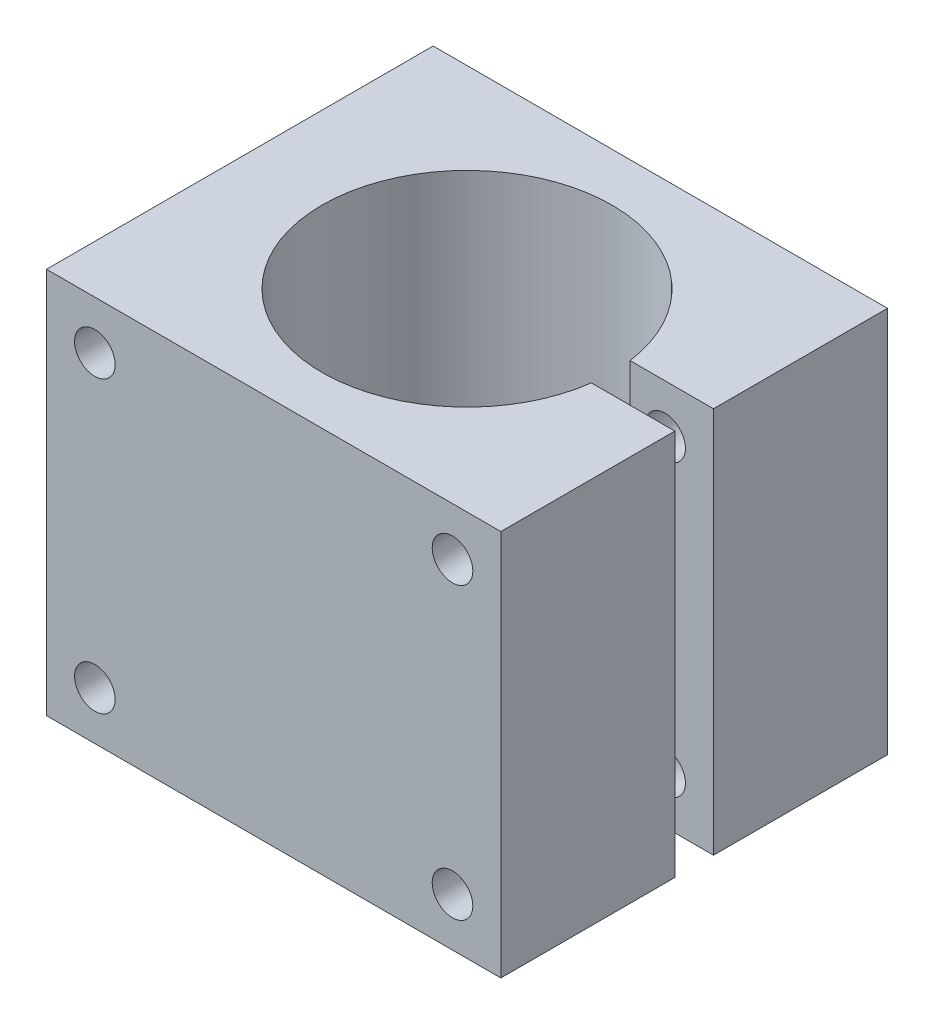
ISO-10303-21;
HEADER;
FILE_DESCRIPTION(('STEP AP214'),'2;1');
FILE_NAME('part.step','',(''),(''),'','','');
FILE_SCHEMA(('AUTOMOTIVE_DESIGN { 1 0 10303 214 1 1 1 1 }'));
ENDSEC;
DATA;
#1=APPLICATION_CONTEXT('core data for automotive mechanical design processes');
#2=APPLICATION_PROTOCOL_DEFINITION('international standard','automotive_design',2000,#1);
#3=PRODUCT_CONTEXT('',#1,'mechanical');
#4=PRODUCT('Part','Part','',(#3));
#5=PRODUCT_RELATED_PRODUCT_CATEGORY('part','',(#4));
#6=PRODUCT_DEFINITION_FORMATION('','',#4);
#7=PRODUCT_DEFINITION_CONTEXT('part definition',#1,'design');
#8=PRODUCT_DEFINITION('design','',#6,#7);
#9=PRODUCT_DEFINITION_SHAPE('','',#8);
#10=(LENGTH_UNIT() NAMED_UNIT(*) SI_UNIT(.MILLI.,.METRE.));
#11=(NAMED_UNIT(*) PLANE_ANGLE_UNIT() SI_UNIT($,.RADIAN.));
#12=(NAMED_UNIT(*) SI_UNIT($,.STERADIAN.) SOLID_ANGLE_UNIT());
#13=UNCERTAINTY_MEASURE_WITH_UNIT(LENGTH_MEASURE(1.E-05),#10,'distance_accuracy_value','');
#14=(GEOMETRIC_REPRESENTATION_CONTEXT(3) GLOBAL_UNCERTAINTY_ASSIGNED_CONTEXT((#13)) GLOBAL_UNIT_ASSIGNED_CONTEXT((#10,
#11,#12)) REPRESENTATION_CONTEXT('',''));
#15=CARTESIAN_POINT('',(0.,0.,0.));
#16=DIRECTION('',(0.,0.,1.));
#17=DIRECTION('',(1.,0.,0.));
#18=AXIS2_PLACEMENT_3D('',#15,#16,#17);
#19=CARTESIAN_POINT('',(42.,-5.,40.));
#20=DIRECTION('',(-1.,0.,0.));
#21=DIRECTION('',(0.,0.,1.));
#22=AXIS2_PLACEMENT_3D('',#19,#20,#21);
#23=PLANE('',#22);
#24=DIRECTION('',(0.,1.,0.));
#25=VECTOR('',#24,1.);
#26=CARTESIAN_POINT('',(42.,-5.,22.));
#27=LINE('',#26,#25);
#28=CARTESIAN_POINT('',(42.,-5.,22.));
#29=VERTEX_POINT('',#28);
#30=CARTESIAN_POINT('',(42.,35.,22.));
#31=VERTEX_POINT('',#30);
#32=EDGE_CURVE('E97',#29,#31,#27,.T.);
#33=ORIENTED_EDGE('',*,*,#32,.T.);
#34=DIRECTION('',(0.,0.,-1.));
#35=VECTOR('',#34,1.);
#36=CARTESIAN_POINT('',(42.,35.,40.));
#37=LINE('',#36,#35);
#38=CARTESIAN_POINT('',(42.,35.,40.));
#39=VERTEX_POINT('',#38);
#40=EDGE_CURVE('E121',#39,#31,#37,.T.);
#41=ORIENTED_EDGE('',*,*,#40,.F.);
#42=DIRECTION('',(0.,1.,0.));
#43=VECTOR('',#42,1.);
#44=CARTESIAN_POINT('',(42.,-5.,40.));
#45=LINE('',#44,#43);
#46=CARTESIAN_POINT('',(42.,-5.,40.));
#47=VERTEX_POINT('',#46);
#48=EDGE_CURVE('E119',#47,#39,#45,.T.);
#49=ORIENTED_EDGE('',*,*,#48,.F.);
#50=DIRECTION('',(0.,0.,-1.));
#51=VECTOR('',#50,1.);
#52=CARTESIAN_POINT('',(42.,-5.,40.));
#53=LINE('',#52,#51);
#54=EDGE_CURVE('E42',#47,#29,#53,.T.);
#55=ORIENTED_EDGE('',*,*,#54,.T.);
#56=EDGE_LOOP('',(#33,#41,#49,#55));
#57=FACE_BOUND('',#56,.T.);
#58=ADVANCED_FACE('F34',(#57),#23,.F.);
#59=CARTESIAN_POINT('',(37.,0.,40.));
#60=DIRECTION('',(0.,0.,-1.));
#61=DIRECTION('',(-1.,0.,0.));
#62=AXIS2_PLACEMENT_3D('',#59,#60,#61);
#63=CYLINDRICAL_SURFACE('',#62,2.1);
#64=CARTESIAN_POINT('',(37.,0.,40.));
#65=DIRECTION('',(0.,0.,1.));
#66=DIRECTION('',(1.,0.,0.));
#67=AXIS2_PLACEMENT_3D('',#64,#65,#66);
#68=CIRCLE('',#67,2.1);
#69=CARTESIAN_POINT('',(39.1,0.,40.));
#70=VERTEX_POINT('',#69);
#71=EDGE_CURVE('E151',#70,#70,#68,.T.);
#72=ORIENTED_EDGE('',*,*,#71,.T.);
#73=EDGE_LOOP('',(#72));
#74=FACE_BOUND('',#73,.T.);
#75=CARTESIAN_POINT('',(37.,0.,22.));
#76=DIRECTION('',(0.,0.,-1.));
#77=DIRECTION('',(-1.,0.,0.));
#78=AXIS2_PLACEMENT_3D('',#75,#76,#77);
#79=CIRCLE('',#78,2.1);
#80=CARTESIAN_POINT('',(34.9,0.,22.));
#81=VERTEX_POINT('',#80);
#82=EDGE_CURVE('E181',#81,#81,#79,.T.);
#83=ORIENTED_EDGE('',*,*,#82,.T.);
#84=EDGE_LOOP('',(#83));
#85=FACE_BOUND('',#84,.T.);
#86=ADVANCED_FACE('F227',(#74,#85),#63,.F.);
#87=CARTESIAN_POINT('',(37.,30.,40.));
#88=DIRECTION('',(0.,0.,-1.));
#89=DIRECTION('',(-1.,0.,0.));
#90=AXIS2_PLACEMENT_3D('',#87,#88,#89);
#91=CYLINDRICAL_SURFACE('',#90,2.1);
#92=CARTESIAN_POINT('',(37.,30.,40.));
#93=DIRECTION('',(0.,0.,1.));
#94=DIRECTION('',(1.,0.,0.));
#95=AXIS2_PLACEMENT_3D('',#92,#93,#94);
#96=CIRCLE('',#95,2.1);
#97=CARTESIAN_POINT('',(39.1,30.,40.));
#98=VERTEX_POINT('',#97);
#99=EDGE_CURVE('E163',#98,#98,#96,.T.);
#100=ORIENTED_EDGE('',*,*,#99,.T.);
#101=EDGE_LOOP('',(#100));
#102=FACE_BOUND('',#101,.T.);
#103=CARTESIAN_POINT('',(37.,30.,22.));
#104=DIRECTION('',(0.,0.,-1.));
#105=DIRECTION('',(-1.,0.,0.));
#106=AXIS2_PLACEMENT_3D('',#103,#104,#105);
#107=CIRCLE('',#106,2.1);
#108=CARTESIAN_POINT('',(34.9,30.,22.));
#109=VERTEX_POINT('',#108);
#110=EDGE_CURVE('E184',#109,#109,#107,.T.);
#111=ORIENTED_EDGE('',*,*,#110,.T.);
#112=EDGE_LOOP('',(#111));
#113=FACE_BOUND('',#112,.T.);
#114=ADVANCED_FACE('F232',(#102,#113),#91,.F.);
#115=CARTESIAN_POINT('',(0.,0.,40.));
#116=DIRECTION('',(0.,0.,-1.));
#117=DIRECTION('',(-1.,0.,0.));
#118=AXIS2_PLACEMENT_3D('',#115,#116,#117);
#119=PLANE('',#118);
#120=CARTESIAN_POINT('',(0.,30.,40.));
#121=DIRECTION('',(0.,0.,1.));
#122=DIRECTION('',(1.,0.,0.));
#123=AXIS2_PLACEMENT_3D('',#120,#121,#122);
#124=CIRCLE('',#123,2.1);
#125=CARTESIAN_POINT('',(2.1,30.,40.));
#126=VERTEX_POINT('',#125);
#127=EDGE_CURVE('E157',#126,#126,#124,.T.);
#128=ORIENTED_EDGE('',*,*,#127,.F.);
#129=EDGE_LOOP('',(#128));
#130=FACE_BOUND('',#129,.T.);
#131=CARTESIAN_POINT('',(0.,0.,40.));
#132=DIRECTION('',(0.,0.,1.));
#133=DIRECTION('',(1.,0.,0.));
#134=AXIS2_PLACEMENT_3D('',#131,#132,#133);
#135=CIRCLE('',#134,2.1);
#136=CARTESIAN_POINT('',(2.1,0.,40.));
#137=VERTEX_POINT('',#136);
#138=EDGE_CURVE('E141',#137,#137,#135,.T.);
#139=ORIENTED_EDGE('',*,*,#138,.F.);
#140=EDGE_LOOP('',(#139));
#141=FACE_BOUND('',#140,.T.);
#142=DIRECTION('',(0.,-1.,0.));
#143=VECTOR('',#142,1.);
#144=CARTESIAN_POINT('',(-5.,-5.,40.));
#145=LINE('',#144,#143);
#146=CARTESIAN_POINT('',(-5.,35.,40.));
#147=VERTEX_POINT('',#146);
#148=CARTESIAN_POINT('',(-5.,-5.,40.));
#149=VERTEX_POINT('',#148);
#150=EDGE_CURVE('E131',#147,#149,#145,.T.);
#151=ORIENTED_EDGE('',*,*,#150,.T.);
#152=DIRECTION('',(1.,0.,0.));
#153=VECTOR('',#152,1.);
#154=CARTESIAN_POINT('',(-5.,-5.,40.));
#155=LINE('',#154,#153);
#156=EDGE_CURVE('E144',#149,#47,#155,.T.);
#157=ORIENTED_EDGE('',*,*,#156,.T.);
#158=ORIENTED_EDGE('',*,*,#48,.T.);
#159=DIRECTION('',(-1.,0.,0.));
#160=VECTOR('',#159,1.);
#161=CARTESIAN_POINT('',(-5.,35.,40.));
#162=LINE('',#161,#160);
#163=EDGE_CURVE('E128',#39,#147,#162,.T.);
#164=ORIENTED_EDGE('',*,*,#163,.T.);
#165=EDGE_LOOP('',(#151,#157,#158,#164));
#166=FACE_BOUND('',#165,.T.);
#167=ORIENTED_EDGE('',*,*,#71,.F.);
#168=EDGE_LOOP('',(#167));
#169=FACE_BOUND('',#168,.T.);
#170=ORIENTED_EDGE('',*,*,#99,.F.);
#171=EDGE_LOOP('',(#170));
#172=FACE_BOUND('',#171,.T.);
#173=ADVANCED_FACE('F203',(#130,#141,#166,#169,#172),#119,.F.);
#174=CARTESIAN_POINT('',(0.,0.,0.));
#175=DIRECTION('',(0.,0.,-1.));
#176=DIRECTION('',(-1.,0.,0.));
#177=AXIS2_PLACEMENT_3D('',#174,#175,#176);
#178=PLANE('',#177);
#179=CARTESIAN_POINT('',(0.,30.,0.));
#180=DIRECTION('',(0.,0.,1.));
#181=DIRECTION('',(1.,0.,0.));
#182=AXIS2_PLACEMENT_3D('',#179,#180,#181);
#183=CIRCLE('',#182,2.1);
#184=CARTESIAN_POINT('',(2.1,30.,0.));
#185=VERTEX_POINT('',#184);
#186=EDGE_CURVE('E160',#185,#185,#183,.T.);
#187=ORIENTED_EDGE('',*,*,#186,.T.);
#188=EDGE_LOOP('',(#187));
#189=FACE_BOUND('',#188,.T.);
#190=CARTESIAN_POINT('',(0.,0.,0.));
#191=DIRECTION('',(0.,0.,1.));
#192=DIRECTION('',(1.,0.,0.));
#193=AXIS2_PLACEMENT_3D('',#190,#191,#192);
#194=CIRCLE('',#193,2.1);
#195=CARTESIAN_POINT('',(2.1,0.,0.));
#196=VERTEX_POINT('',#195);
#197=EDGE_CURVE('E148',#196,#196,#194,.T.);
#198=ORIENTED_EDGE('',*,*,#197,.T.);
#199=EDGE_LOOP('',(#198));
#200=FACE_BOUND('',#199,.T.);
#201=DIRECTION('',(0.,-1.,0.));
#202=VECTOR('',#201,1.);
#203=CARTESIAN_POINT('',(-5.,-5.,0.));
#204=LINE('',#203,#202);
#205=CARTESIAN_POINT('',(-5.,35.,0.));
#206=VERTEX_POINT('',#205);
#207=CARTESIAN_POINT('',(-5.,-5.,0.));
#208=VERTEX_POINT('',#207);
#209=EDGE_CURVE('E138',#206,#208,#204,.T.);
#210=ORIENTED_EDGE('',*,*,#209,.F.);
#211=DIRECTION('',(-1.,0.,0.));
#212=VECTOR('',#211,1.);
#213=CARTESIAN_POINT('',(-5.,35.,0.));
#214=LINE('',#213,#212);
#215=CARTESIAN_POINT('',(42.,35.,0.));
#216=VERTEX_POINT('',#215);
#217=EDGE_CURVE('E129',#216,#206,#214,.T.);
#218=ORIENTED_EDGE('',*,*,#217,.F.);
#219=DIRECTION('',(0.,1.,0.));
#220=VECTOR('',#219,1.);
#221=CARTESIAN_POINT('',(42.,-5.,0.));
#222=LINE('',#221,#220);
#223=CARTESIAN_POINT('',(42.,-5.,0.));
#224=VERTEX_POINT('',#223);
#225=EDGE_CURVE('E132',#224,#216,#222,.T.);
#226=ORIENTED_EDGE('',*,*,#225,.F.);
#227=DIRECTION('',(1.,0.,0.));
#228=VECTOR('',#227,1.);
#229=CARTESIAN_POINT('',(-5.,-5.,0.));
#230=LINE('',#229,#228);
#231=EDGE_CURVE('E135',#208,#224,#230,.T.);
#232=ORIENTED_EDGE('',*,*,#231,.F.);
#233=EDGE_LOOP('',(#210,#218,#226,#232));
#234=FACE_BOUND('',#233,.T.);
#235=CARTESIAN_POINT('',(37.,0.,0.));
#236=DIRECTION('',(0.,0.,1.));
#237=DIRECTION('',(1.,0.,0.));
#238=AXIS2_PLACEMENT_3D('',#235,#236,#237);
#239=CIRCLE('',#238,2.1);
#240=CARTESIAN_POINT('',(39.1,0.,0.));
#241=VERTEX_POINT('',#240);
#242=EDGE_CURVE('E154',#241,#241,#239,.T.);
#243=ORIENTED_EDGE('',*,*,#242,.T.);
#244=EDGE_LOOP('',(#243));
#245=FACE_BOUND('',#244,.T.);
#246=CARTESIAN_POINT('',(37.,30.,0.));
#247=DIRECTION('',(0.,0.,1.));
#248=DIRECTION('',(1.,0.,0.));
#249=AXIS2_PLACEMENT_3D('',#246,#247,#248);
#250=CIRCLE('',#249,2.1);
#251=CARTESIAN_POINT('',(39.1,30.,0.));
#252=VERTEX_POINT('',#251);
#253=EDGE_CURVE('E166',#252,#252,#250,.T.);
#254=ORIENTED_EDGE('',*,*,#253,.T.);
#255=EDGE_LOOP('',(#254));
#256=FACE_BOUND('',#255,.T.);
#257=ADVANCED_FACE('F211',(#189,#200,#234,#245,#256),#178,.T.);
#258=CARTESIAN_POINT('',(-5.,-5.,40.));
#259=DIRECTION('',(1.,0.,0.));
#260=DIRECTION('',(0.,0.,-1.));
#261=AXIS2_PLACEMENT_3D('',#258,#259,#260);
#262=PLANE('',#261);
#263=ORIENTED_EDGE('',*,*,#209,.T.);
#264=DIRECTION('',(0.,0.,-1.));
#265=VECTOR('',#264,1.);
#266=CARTESIAN_POINT('',(-5.,-5.,40.));
#267=LINE('',#266,#265);
#268=EDGE_CURVE('E12',#149,#208,#267,.T.);
#269=ORIENTED_EDGE('',*,*,#268,.F.);
#270=ORIENTED_EDGE('',*,*,#150,.F.);
#271=DIRECTION('',(0.,0.,-1.));
#272=VECTOR('',#271,1.);
#273=CARTESIAN_POINT('',(-5.,35.,40.));
#274=LINE('',#273,#272);
#275=EDGE_CURVE('E125',#147,#206,#274,.T.);
#276=ORIENTED_EDGE('',*,*,#275,.T.);
#277=EDGE_LOOP('',(#263,#269,#270,#276));
#278=FACE_BOUND('',#277,.T.);
#279=ADVANCED_FACE('F36',(#278),#262,.F.);
#280=CARTESIAN_POINT('',(-5.,-5.,40.));
#281=DIRECTION('',(0.,1.,0.));
#282=DIRECTION('',(-1.,0.,0.));
#283=AXIS2_PLACEMENT_3D('',#280,#281,#282);
#284=PLANE('',#283);
#285=CARTESIAN_POINT('',(42.,-5.,18.));
#286=VERTEX_POINT('',#285);
#287=EDGE_CURVE('E120',#286,#224,#53,.T.);
#288=ORIENTED_EDGE('',*,*,#287,.F.);
#289=DIRECTION('',(-1.,0.,0.));
#290=VECTOR('',#289,1.);
#291=CARTESIAN_POINT('',(0.,-5.,18.));
#292=LINE('',#291,#290);
#293=CARTESIAN_POINT('',(33.3660687473185,-5.,18.));
#294=VERTEX_POINT('',#293);
#295=EDGE_CURVE('E117',#286,#294,#292,.T.);
#296=ORIENTED_EDGE('',*,*,#295,.T.);
#297=CARTESIAN_POINT('',(18.5,-5.,20.));
#298=DIRECTION('',(0.,1.,0.));
#299=DIRECTION('',(0.,0.,1.));
#300=AXIS2_PLACEMENT_3D('',#297,#298,#299);
#301=CIRCLE('',#300,15.);
#302=CARTESIAN_POINT('',(33.3660687473185,-5.,22.));
#303=VERTEX_POINT('',#302);
#304=EDGE_CURVE('E116',#294,#303,#301,.T.);
#305=ORIENTED_EDGE('',*,*,#304,.T.);
#306=DIRECTION('',(-1.,0.,0.));
#307=VECTOR('',#306,1.);
#308=CARTESIAN_POINT('',(0.,-5.,22.));
#309=LINE('',#308,#307);
#310=EDGE_CURVE('E57',#29,#303,#309,.T.);
#311=ORIENTED_EDGE('',*,*,#310,.F.);
#312=ORIENTED_EDGE('',*,*,#54,.F.);
#313=ORIENTED_EDGE('',*,*,#156,.F.);
#314=ORIENTED_EDGE('',*,*,#268,.T.);
#315=ORIENTED_EDGE('',*,*,#231,.T.);
#316=EDGE_LOOP('',(#288,#296,#305,#311,#312,#313,#314,#315));
#317=FACE_BOUND('',#316,.T.);
#318=ADVANCED_FACE('F112',(#317),#284,.F.);
#319=CARTESIAN_POINT('',(42.,35.,18.));
#320=VERTEX_POINT('',#319);
#321=EDGE_CURVE('E124',#320,#216,#37,.T.);
#322=ORIENTED_EDGE('',*,*,#321,.F.);
#323=DIRECTION('',(0.,1.,0.));
#324=VECTOR('',#323,1.);
#325=CARTESIAN_POINT('',(42.,-5.,18.));
#326=LINE('',#325,#324);
#327=EDGE_CURVE('E105',#286,#320,#326,.T.);
#328=ORIENTED_EDGE('',*,*,#327,.F.);
#329=ORIENTED_EDGE('',*,*,#287,.T.);
#330=ORIENTED_EDGE('',*,*,#225,.T.);
#331=EDGE_LOOP('',(#322,#328,#329,#330));
#332=FACE_BOUND('',#331,.T.);
#333=ADVANCED_FACE('F215',(#332),#23,.F.);
#334=CARTESIAN_POINT('',(-5.,35.,40.));
#335=DIRECTION('',(0.,-1.,0.));
#336=DIRECTION('',(0.,0.,-1.));
#337=AXIS2_PLACEMENT_3D('',#334,#335,#336);
#338=PLANE('',#337);
#339=CARTESIAN_POINT('',(18.5,35.,20.));
#340=DIRECTION('',(0.,1.,0.));
#341=DIRECTION('',(0.,0.,1.));
#342=AXIS2_PLACEMENT_3D('',#339,#340,#341);
#343=CIRCLE('',#342,15.);
#344=CARTESIAN_POINT('',(33.3660687473185,35.,18.));
#345=VERTEX_POINT('',#344);
#346=CARTESIAN_POINT('',(33.3660687473185,35.,22.));
#347=VERTEX_POINT('',#346);
#348=EDGE_CURVE('E171',#345,#347,#343,.T.);
#349=ORIENTED_EDGE('',*,*,#348,.F.);
#350=DIRECTION('',(-1.,0.,0.));
#351=VECTOR('',#350,1.);
#352=CARTESIAN_POINT('',(0.,35.,18.));
#353=LINE('',#352,#351);
#354=EDGE_CURVE('E49',#320,#345,#353,.T.);
#355=ORIENTED_EDGE('',*,*,#354,.F.);
#356=ORIENTED_EDGE('',*,*,#321,.T.);
#357=ORIENTED_EDGE('',*,*,#217,.T.);
#358=ORIENTED_EDGE('',*,*,#275,.F.);
#359=ORIENTED_EDGE('',*,*,#163,.F.);
#360=ORIENTED_EDGE('',*,*,#40,.T.);
#361=DIRECTION('',(-1.,0.,0.));
#362=VECTOR('',#361,1.);
#363=CARTESIAN_POINT('',(0.,35.,22.));
#364=LINE('',#363,#362);
#365=EDGE_CURVE('E100',#31,#347,#364,.T.);
#366=ORIENTED_EDGE('',*,*,#365,.T.);
#367=EDGE_LOOP('',(#349,#355,#356,#357,#358,#359,#360,#366));
#368=FACE_BOUND('',#367,.T.);
#369=ADVANCED_FACE('F198',(#368),#338,.F.);
#370=CARTESIAN_POINT('',(0.,0.,40.));
#371=DIRECTION('',(0.,0.,-1.));
#372=DIRECTION('',(-1.,0.,0.));
#373=AXIS2_PLACEMENT_3D('',#370,#371,#372);
#374=CYLINDRICAL_SURFACE('',#373,2.1);
#375=ORIENTED_EDGE('',*,*,#138,.T.);
#376=EDGE_LOOP('',(#375));
#377=FACE_BOUND('',#376,.T.);
#378=ORIENTED_EDGE('',*,*,#197,.F.);
#379=EDGE_LOOP('',(#378));
#380=FACE_BOUND('',#379,.T.);
#381=ADVANCED_FACE('F242',(#377,#380),#374,.F.);
#382=CARTESIAN_POINT('',(37.,0.,18.));
#383=DIRECTION('',(0.,0.,-1.));
#384=DIRECTION('',(-1.,0.,0.));
#385=AXIS2_PLACEMENT_3D('',#382,#383,#384);
#386=CIRCLE('',#385,2.1);
#387=CARTESIAN_POINT('',(34.9,0.,18.));
#388=VERTEX_POINT('',#387);
#389=EDGE_CURVE('E174',#388,#388,#386,.T.);
#390=ORIENTED_EDGE('',*,*,#389,.F.);
#391=EDGE_LOOP('',(#390));
#392=FACE_BOUND('',#391,.T.);
#393=ORIENTED_EDGE('',*,*,#242,.F.);
#394=EDGE_LOOP('',(#393));
#395=FACE_BOUND('',#394,.T.);
#396=ADVANCED_FACE('F235',(#392,#395),#63,.F.);
#397=CARTESIAN_POINT('',(0.,30.,40.));
#398=DIRECTION('',(0.,0.,-1.));
#399=DIRECTION('',(-1.,0.,0.));
#400=AXIS2_PLACEMENT_3D('',#397,#398,#399);
#401=CYLINDRICAL_SURFACE('',#400,2.1);
#402=ORIENTED_EDGE('',*,*,#127,.T.);
#403=EDGE_LOOP('',(#402));
#404=FACE_BOUND('',#403,.T.);
#405=ORIENTED_EDGE('',*,*,#186,.F.);
#406=EDGE_LOOP('',(#405));
#407=FACE_BOUND('',#406,.T.);
#408=ADVANCED_FACE('F262',(#404,#407),#401,.F.);
#409=CARTESIAN_POINT('',(37.,30.,18.));
#410=DIRECTION('',(0.,0.,-1.));
#411=DIRECTION('',(-1.,0.,0.));
#412=AXIS2_PLACEMENT_3D('',#409,#410,#411);
#413=CIRCLE('',#412,2.1);
#414=CARTESIAN_POINT('',(34.9,30.,18.));
#415=VERTEX_POINT('',#414);
#416=EDGE_CURVE('E178',#415,#415,#413,.T.);
#417=ORIENTED_EDGE('',*,*,#416,.F.);
#418=EDGE_LOOP('',(#417));
#419=FACE_BOUND('',#418,.T.);
#420=ORIENTED_EDGE('',*,*,#253,.F.);
#421=EDGE_LOOP('',(#420));
#422=FACE_BOUND('',#421,.T.);
#423=ADVANCED_FACE('F266',(#419,#422),#91,.F.);
#424=CARTESIAN_POINT('',(18.5,-5.,20.));
#425=DIRECTION('',(0.,1.,0.));
#426=DIRECTION('',(0.,0.,1.));
#427=AXIS2_PLACEMENT_3D('',#424,#425,#426);
#428=CYLINDRICAL_SURFACE('',#427,15.);
#429=ORIENTED_EDGE('',*,*,#304,.F.);
#430=DIRECTION('',(0.,1.,0.));
#431=VECTOR('',#430,1.);
#432=CARTESIAN_POINT('',(33.3660687473185,-5.,18.));
#433=LINE('',#432,#431);
#434=EDGE_CURVE('E187',#294,#345,#433,.T.);
#435=ORIENTED_EDGE('',*,*,#434,.T.);
#436=ORIENTED_EDGE('',*,*,#348,.T.);
#437=DIRECTION('',(0.,1.,0.));
#438=VECTOR('',#437,1.);
#439=CARTESIAN_POINT('',(33.3660687473185,-5.,22.));
#440=LINE('',#439,#438);
#441=EDGE_CURVE('E106',#303,#347,#440,.T.);
#442=ORIENTED_EDGE('',*,*,#441,.F.);
#443=EDGE_LOOP('',(#429,#435,#436,#442));
#444=FACE_BOUND('',#443,.T.);
#445=ADVANCED_FACE('F195',(#444),#428,.F.);
#446=CARTESIAN_POINT('',(0.,-5.,22.));
#447=DIRECTION('',(0.,0.,-1.));
#448=DIRECTION('',(-1.,0.,0.));
#449=AXIS2_PLACEMENT_3D('',#446,#447,#448);
#450=PLANE('',#449);
#451=ORIENTED_EDGE('',*,*,#82,.F.);
#452=EDGE_LOOP('',(#451));
#453=FACE_BOUND('',#452,.T.);
#454=ORIENTED_EDGE('',*,*,#110,.F.);
#455=EDGE_LOOP('',(#454));
#456=FACE_BOUND('',#455,.T.);
#457=ORIENTED_EDGE('',*,*,#365,.F.);
#458=ORIENTED_EDGE('',*,*,#32,.F.);
#459=ORIENTED_EDGE('',*,*,#310,.T.);
#460=ORIENTED_EDGE('',*,*,#441,.T.);
#461=EDGE_LOOP('',(#457,#458,#459,#460));
#462=FACE_BOUND('',#461,.T.);
#463=ADVANCED_FACE('F98',(#453,#456,#462),#450,.T.);
#464=CARTESIAN_POINT('',(0.,-5.,18.));
#465=DIRECTION('',(0.,0.,-1.));
#466=DIRECTION('',(-1.,0.,0.));
#467=AXIS2_PLACEMENT_3D('',#464,#465,#466);
#468=PLANE('',#467);
#469=ORIENTED_EDGE('',*,*,#389,.T.);
#470=EDGE_LOOP('',(#469));
#471=FACE_BOUND('',#470,.T.);
#472=ORIENTED_EDGE('',*,*,#416,.T.);
#473=EDGE_LOOP('',(#472));
#474=FACE_BOUND('',#473,.T.);
#475=ORIENTED_EDGE('',*,*,#354,.T.);
#476=ORIENTED_EDGE('',*,*,#434,.F.);
#477=ORIENTED_EDGE('',*,*,#295,.F.);
#478=ORIENTED_EDGE('',*,*,#327,.T.);
#479=EDGE_LOOP('',(#475,#476,#477,#478));
#480=FACE_BOUND('',#479,.T.);
#481=ADVANCED_FACE('F216',(#471,#474,#480),#468,.F.);
#482=CLOSED_SHELL('',(#58,#86,#114,#173,#257,#279,#318,#333,#369,#381,#396,#408,#423,#445,#463,#481));
#483=MANIFOLD_SOLID_BREP('B2',#482);
#484=ADVANCED_BREP_SHAPE_REPRESENTATION('',(#18,#483),#14);
#485=SHAPE_DEFINITION_REPRESENTATION(#9,#484);
ENDSEC;
END-ISO-10303-21;
